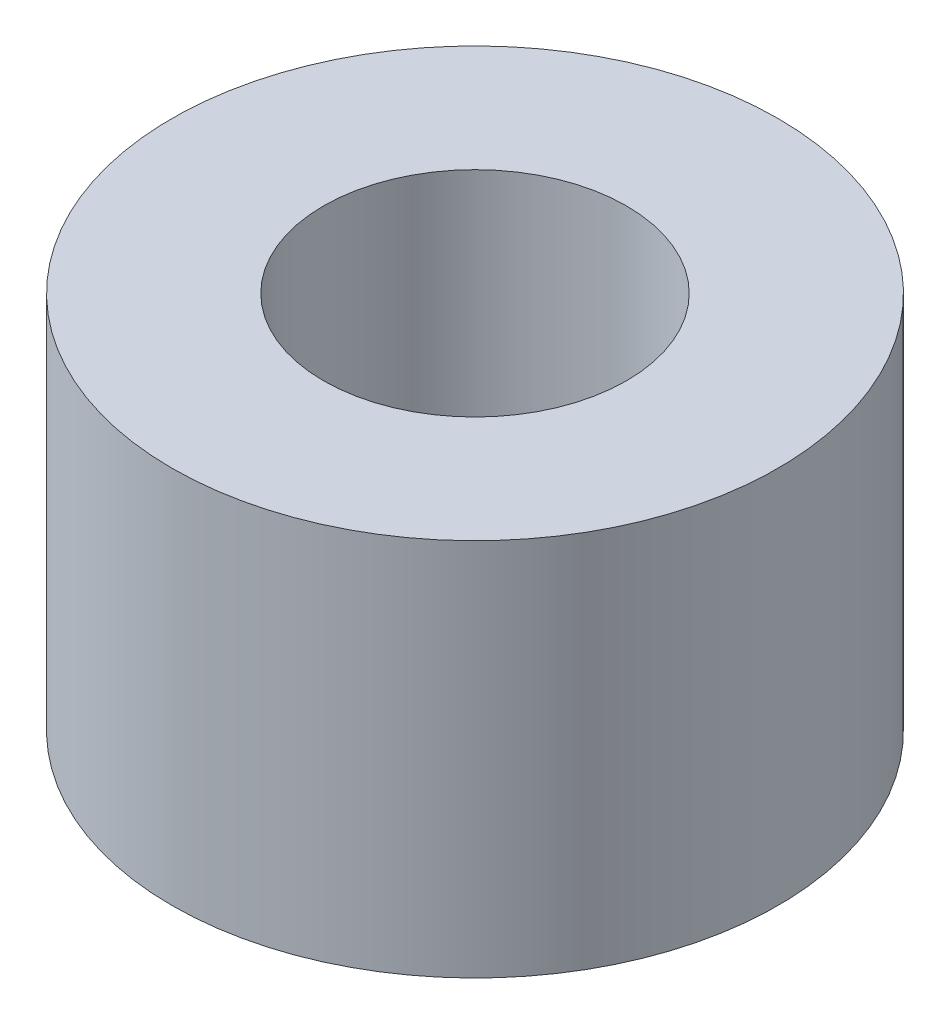
ISO-10303-21;
HEADER;
FILE_DESCRIPTION(('STEP AP214'),'2;1');
FILE_NAME('part.step','',(''),(''),'','','');
FILE_SCHEMA(('AUTOMOTIVE_DESIGN { 1 0 10303 214 1 1 1 1 }'));
ENDSEC;
DATA;
#1=APPLICATION_CONTEXT('core data for automotive mechanical design processes');
#2=APPLICATION_PROTOCOL_DEFINITION('international standard','automotive_design',2000,#1);
#3=PRODUCT_CONTEXT('',#1,'mechanical');
#4=PRODUCT('Part','Part','',(#3));
#5=PRODUCT_RELATED_PRODUCT_CATEGORY('part','',(#4));
#6=PRODUCT_DEFINITION_FORMATION('','',#4);
#7=PRODUCT_DEFINITION_CONTEXT('part definition',#1,'design');
#8=PRODUCT_DEFINITION('design','',#6,#7);
#9=PRODUCT_DEFINITION_SHAPE('','',#8);
#10=(LENGTH_UNIT() NAMED_UNIT(*) SI_UNIT(.MILLI.,.METRE.));
#11=(NAMED_UNIT(*) PLANE_ANGLE_UNIT() SI_UNIT($,.RADIAN.));
#12=(NAMED_UNIT(*) SI_UNIT($,.STERADIAN.) SOLID_ANGLE_UNIT());
#13=UNCERTAINTY_MEASURE_WITH_UNIT(LENGTH_MEASURE(1.E-05),#10,'distance_accuracy_value','');
#14=(GEOMETRIC_REPRESENTATION_CONTEXT(3) GLOBAL_UNCERTAINTY_ASSIGNED_CONTEXT((#13)) GLOBAL_UNIT_ASSIGNED_CONTEXT((#10,
#11,#12)) REPRESENTATION_CONTEXT('',''));
#15=CARTESIAN_POINT('',(0.,0.,0.));
#16=DIRECTION('',(0.,0.,1.));
#17=DIRECTION('',(1.,0.,0.));
#18=AXIS2_PLACEMENT_3D('',#15,#16,#17);
#19=CARTESIAN_POINT('',(0.,5.,0.));
#20=DIRECTION('',(0.,1.,0.));
#21=DIRECTION('',(0.,0.,1.));
#22=AXIS2_PLACEMENT_3D('',#19,#20,#21);
#23=PLANE('',#22);
#24=CARTESIAN_POINT('',(0.,5.,0.));
#25=DIRECTION('',(0.,1.,0.));
#26=DIRECTION('',(0.,0.,1.));
#27=AXIS2_PLACEMENT_3D('',#24,#25,#26);
#28=CIRCLE('',#27,4.);
#29=CARTESIAN_POINT('',(0.,5.,4.));
#30=VERTEX_POINT('',#29);
#31=EDGE_CURVE('E10',#30,#30,#28,.T.);
#32=ORIENTED_EDGE('',*,*,#31,.T.);
#33=EDGE_LOOP('',(#32));
#34=FACE_BOUND('',#33,.T.);
#35=CARTESIAN_POINT('',(0.,5.,0.));
#36=DIRECTION('',(0.,1.,0.));
#37=DIRECTION('',(0.,0.,1.));
#38=AXIS2_PLACEMENT_3D('',#35,#36,#37);
#39=CIRCLE('',#38,2.);
#40=CARTESIAN_POINT('',(0.,5.,2.));
#41=VERTEX_POINT('',#40);
#42=EDGE_CURVE('E50',#41,#41,#39,.T.);
#43=ORIENTED_EDGE('',*,*,#42,.F.);
#44=EDGE_LOOP('',(#43));
#45=FACE_BOUND('',#44,.T.);
#46=ADVANCED_FACE('F37',(#34,#45),#23,.T.);
#47=CARTESIAN_POINT('',(0.,0.,0.));
#48=DIRECTION('',(0.,1.,0.));
#49=DIRECTION('',(0.,0.,1.));
#50=AXIS2_PLACEMENT_3D('',#47,#48,#49);
#51=PLANE('',#50);
#52=CARTESIAN_POINT('',(0.,0.,0.));
#53=DIRECTION('',(0.,1.,0.));
#54=DIRECTION('',(0.,0.,1.));
#55=AXIS2_PLACEMENT_3D('',#52,#53,#54);
#56=CIRCLE('',#55,4.);
#57=CARTESIAN_POINT('',(0.,0.,4.));
#58=VERTEX_POINT('',#57);
#59=EDGE_CURVE('E41',#58,#58,#56,.T.);
#60=ORIENTED_EDGE('',*,*,#59,.F.);
#61=EDGE_LOOP('',(#60));
#62=FACE_BOUND('',#61,.T.);
#63=CARTESIAN_POINT('',(0.,0.,0.));
#64=DIRECTION('',(0.,1.,0.));
#65=DIRECTION('',(0.,0.,1.));
#66=AXIS2_PLACEMENT_3D('',#63,#64,#65);
#67=CIRCLE('',#66,2.);
#68=CARTESIAN_POINT('',(0.,0.,2.));
#69=VERTEX_POINT('',#68);
#70=EDGE_CURVE('E52',#69,#69,#67,.T.);
#71=ORIENTED_EDGE('',*,*,#70,.T.);
#72=EDGE_LOOP('',(#71));
#73=FACE_BOUND('',#72,.T.);
#74=ADVANCED_FACE('F64',(#62,#73),#51,.F.);
#75=CARTESIAN_POINT('',(0.,5.,0.));
#76=DIRECTION('',(0.,-1.,0.));
#77=DIRECTION('',(0.,0.,-1.));
#78=AXIS2_PLACEMENT_3D('',#75,#76,#77);
#79=CYLINDRICAL_SURFACE('',#78,4.);
#80=ORIENTED_EDGE('',*,*,#31,.F.);
#81=EDGE_LOOP('',(#80));
#82=FACE_BOUND('',#81,.T.);
#83=ORIENTED_EDGE('',*,*,#59,.T.);
#84=EDGE_LOOP('',(#83));
#85=FACE_BOUND('',#84,.T.);
#86=ADVANCED_FACE('F39',(#82,#85),#79,.T.);
#87=CARTESIAN_POINT('',(0.,5.,0.));
#88=DIRECTION('',(0.,-1.,0.));
#89=DIRECTION('',(0.,0.,-1.));
#90=AXIS2_PLACEMENT_3D('',#87,#88,#89);
#91=CYLINDRICAL_SURFACE('',#90,2.);
#92=ORIENTED_EDGE('',*,*,#42,.T.);
#93=EDGE_LOOP('',(#92));
#94=FACE_BOUND('',#93,.T.);
#95=ORIENTED_EDGE('',*,*,#70,.F.);
#96=EDGE_LOOP('',(#95));
#97=FACE_BOUND('',#96,.T.);
#98=ADVANCED_FACE('F60',(#94,#97),#91,.F.);
#99=CLOSED_SHELL('',(#46,#74,#86,#98));
#100=MANIFOLD_SOLID_BREP('B2',#99);
#101=ADVANCED_BREP_SHAPE_REPRESENTATION('',(#18,#100),#14);
#102=SHAPE_DEFINITION_REPRESENTATION(#9,#101);
ENDSEC;
END-ISO-10303-21;
